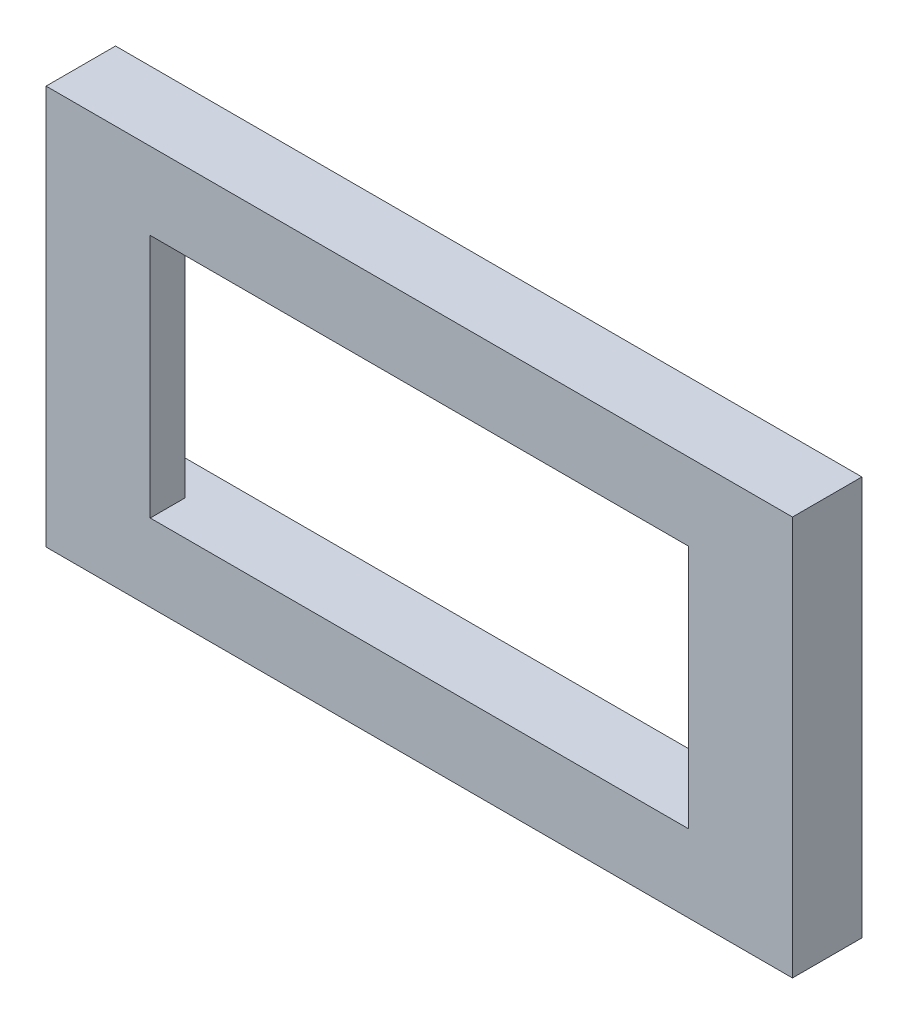
ISO-10303-21;
HEADER;
FILE_DESCRIPTION(('STEP AP214'),'2;1');
FILE_NAME('part.step','',(''),(''),'','','');
FILE_SCHEMA(('AUTOMOTIVE_DESIGN { 1 0 10303 214 1 1 1 1 }'));
ENDSEC;
DATA;
#1=APPLICATION_CONTEXT('core data for automotive mechanical design processes');
#2=APPLICATION_PROTOCOL_DEFINITION('international standard','automotive_design',2000,#1);
#3=PRODUCT_CONTEXT('',#1,'mechanical');
#4=PRODUCT('Part','Part','',(#3));
#5=PRODUCT_RELATED_PRODUCT_CATEGORY('part','',(#4));
#6=PRODUCT_DEFINITION_FORMATION('','',#4);
#7=PRODUCT_DEFINITION_CONTEXT('part definition',#1,'design');
#8=PRODUCT_DEFINITION('design','',#6,#7);
#9=PRODUCT_DEFINITION_SHAPE('','',#8);
#10=(LENGTH_UNIT() NAMED_UNIT(*) SI_UNIT(.MILLI.,.METRE.));
#11=(NAMED_UNIT(*) PLANE_ANGLE_UNIT() SI_UNIT($,.RADIAN.));
#12=(NAMED_UNIT(*) SI_UNIT($,.STERADIAN.) SOLID_ANGLE_UNIT());
#13=UNCERTAINTY_MEASURE_WITH_UNIT(LENGTH_MEASURE(1.E-05),#10,'distance_accuracy_value','');
#14=(GEOMETRIC_REPRESENTATION_CONTEXT(3) GLOBAL_UNCERTAINTY_ASSIGNED_CONTEXT((#13)) GLOBAL_UNIT_ASSIGNED_CONTEXT((#10,
#11,#12)) REPRESENTATION_CONTEXT('',''));
#15=CARTESIAN_POINT('',(0.,0.,0.));
#16=DIRECTION('',(0.,0.,1.));
#17=DIRECTION('',(1.,0.,0.));
#18=AXIS2_PLACEMENT_3D('',#15,#16,#17);
#19=CARTESIAN_POINT('',(0.,0.,0.));
#20=DIRECTION('',(0.,0.,-1.));
#21=DIRECTION('',(-1.,0.,0.));
#22=AXIS2_PLACEMENT_3D('',#19,#20,#21);
#23=PLANE('',#22);
#24=DIRECTION('',(0.,-1.,0.));
#25=VECTOR('',#24,1.);
#26=CARTESIAN_POINT('',(0.,0.,0.));
#27=LINE('',#26,#25);
#28=CARTESIAN_POINT('',(0.,23.,0.));
#29=VERTEX_POINT('',#28);
#30=CARTESIAN_POINT('',(0.,0.,0.));
#31=VERTEX_POINT('',#30);
#32=EDGE_CURVE('E208',#29,#31,#27,.T.);
#33=ORIENTED_EDGE('',*,*,#32,.F.);
#34=DIRECTION('',(-1.,0.,0.));
#35=VECTOR('',#34,1.);
#36=CARTESIAN_POINT('',(0.,23.,0.));
#37=LINE('',#36,#35);
#38=CARTESIAN_POINT('',(43.,23.,0.));
#39=VERTEX_POINT('',#38);
#40=EDGE_CURVE('E56',#39,#29,#37,.T.);
#41=ORIENTED_EDGE('',*,*,#40,.F.);
#42=DIRECTION('',(0.,1.,0.));
#43=VECTOR('',#42,1.);
#44=CARTESIAN_POINT('',(43.,0.,0.));
#45=LINE('',#44,#43);
#46=CARTESIAN_POINT('',(43.,0.,0.));
#47=VERTEX_POINT('',#46);
#48=EDGE_CURVE('E213',#47,#39,#45,.T.);
#49=ORIENTED_EDGE('',*,*,#48,.F.);
#50=DIRECTION('',(1.,0.,0.));
#51=VECTOR('',#50,1.);
#52=CARTESIAN_POINT('',(0.,0.,0.));
#53=LINE('',#52,#51);
#54=EDGE_CURVE('E211',#31,#47,#53,.T.);
#55=ORIENTED_EDGE('',*,*,#54,.F.);
#56=EDGE_LOOP('',(#33,#41,#49,#55));
#57=FACE_BOUND('',#56,.T.);
#58=DIRECTION('',(-1.,0.,0.));
#59=VECTOR('',#58,1.);
#60=CARTESIAN_POINT('',(3.99999999999999,18.55,0.));
#61=LINE('',#60,#59);
#62=CARTESIAN_POINT('',(39.,18.55,0.));
#63=VERTEX_POINT('',#62);
#64=CARTESIAN_POINT('',(3.99999999999999,18.55,0.));
#65=VERTEX_POINT('',#64);
#66=EDGE_CURVE('E182',#63,#65,#61,.T.);
#67=ORIENTED_EDGE('',*,*,#66,.T.);
#68=DIRECTION('',(0.,-1.,0.));
#69=VECTOR('',#68,1.);
#70=CARTESIAN_POINT('',(3.99999999999999,18.55,0.));
#71=LINE('',#70,#69);
#72=CARTESIAN_POINT('',(3.99999999999999,4.45,0.));
#73=VERTEX_POINT('',#72);
#74=EDGE_CURVE('E48',#65,#73,#71,.T.);
#75=ORIENTED_EDGE('',*,*,#74,.T.);
#76=DIRECTION('',(1.,0.,0.));
#77=VECTOR('',#76,1.);
#78=CARTESIAN_POINT('',(3.99999999999999,4.45,0.));
#79=LINE('',#78,#77);
#80=CARTESIAN_POINT('',(39.,4.45000000000001,0.));
#81=VERTEX_POINT('',#80);
#82=EDGE_CURVE('E193',#73,#81,#79,.T.);
#83=ORIENTED_EDGE('',*,*,#82,.T.);
#84=DIRECTION('',(0.,1.,0.));
#85=VECTOR('',#84,1.);
#86=CARTESIAN_POINT('',(39.,18.55,0.));
#87=LINE('',#86,#85);
#88=EDGE_CURVE('E196',#81,#63,#87,.T.);
#89=ORIENTED_EDGE('',*,*,#88,.T.);
#90=EDGE_LOOP('',(#67,#75,#83,#89));
#91=FACE_BOUND('',#90,.T.);
#92=ADVANCED_FACE('F33',(#57,#91),#23,.T.);
#93=CARTESIAN_POINT('',(0.,0.,2.));
#94=DIRECTION('',(1.,0.,0.));
#95=DIRECTION('',(0.,0.,-1.));
#96=AXIS2_PLACEMENT_3D('',#93,#94,#95);
#97=PLANE('',#96);
#98=ORIENTED_EDGE('',*,*,#32,.T.);
#99=DIRECTION('',(0.,0.,-1.));
#100=VECTOR('',#99,1.);
#101=CARTESIAN_POINT('',(0.,0.,2.));
#102=LINE('',#101,#100);
#103=CARTESIAN_POINT('',(0.,0.,4.));
#104=VERTEX_POINT('',#103);
#105=EDGE_CURVE('E11',#104,#31,#102,.T.);
#106=ORIENTED_EDGE('',*,*,#105,.F.);
#107=DIRECTION('',(0.,-1.,0.));
#108=VECTOR('',#107,1.);
#109=CARTESIAN_POINT('',(0.,23.,4.));
#110=LINE('',#109,#108);
#111=CARTESIAN_POINT('',(0.,23.,4.));
#112=VERTEX_POINT('',#111);
#113=EDGE_CURVE('E169',#112,#104,#110,.T.);
#114=ORIENTED_EDGE('',*,*,#113,.F.);
#115=DIRECTION('',(0.,0.,-1.));
#116=VECTOR('',#115,1.);
#117=CARTESIAN_POINT('',(0.,23.,2.));
#118=LINE('',#117,#116);
#119=EDGE_CURVE('E216',#112,#29,#118,.T.);
#120=ORIENTED_EDGE('',*,*,#119,.T.);
#121=EDGE_LOOP('',(#98,#106,#114,#120));
#122=FACE_BOUND('',#121,.T.);
#123=ADVANCED_FACE('F35',(#122),#97,.F.);
#124=CARTESIAN_POINT('',(0.,0.,2.));
#125=DIRECTION('',(0.,1.,0.));
#126=DIRECTION('',(-1.,0.,0.));
#127=AXIS2_PLACEMENT_3D('',#124,#125,#126);
#128=PLANE('',#127);
#129=ORIENTED_EDGE('',*,*,#54,.T.);
#130=DIRECTION('',(0.,0.,-1.));
#131=VECTOR('',#130,1.);
#132=CARTESIAN_POINT('',(43.,0.,2.));
#133=LINE('',#132,#131);
#134=CARTESIAN_POINT('',(43.,0.,4.));
#135=VERTEX_POINT('',#134);
#136=EDGE_CURVE('E41',#135,#47,#133,.T.);
#137=ORIENTED_EDGE('',*,*,#136,.F.);
#138=DIRECTION('',(1.,0.,0.));
#139=VECTOR('',#138,1.);
#140=CARTESIAN_POINT('',(0.,0.,4.));
#141=LINE('',#140,#139);
#142=EDGE_CURVE('E172',#104,#135,#141,.T.);
#143=ORIENTED_EDGE('',*,*,#142,.F.);
#144=ORIENTED_EDGE('',*,*,#105,.T.);
#145=EDGE_LOOP('',(#129,#137,#143,#144));
#146=FACE_BOUND('',#145,.T.);
#147=ADVANCED_FACE('F234',(#146),#128,.F.);
#148=CARTESIAN_POINT('',(43.,0.,2.));
#149=DIRECTION('',(-1.,0.,0.));
#150=DIRECTION('',(0.,0.,1.));
#151=AXIS2_PLACEMENT_3D('',#148,#149,#150);
#152=PLANE('',#151);
#153=ORIENTED_EDGE('',*,*,#48,.T.);
#154=DIRECTION('',(0.,0.,-1.));
#155=VECTOR('',#154,1.);
#156=CARTESIAN_POINT('',(43.,23.,2.));
#157=LINE('',#156,#155);
#158=CARTESIAN_POINT('',(43.,23.,4.));
#159=VERTEX_POINT('',#158);
#160=EDGE_CURVE('E218',#159,#39,#157,.T.);
#161=ORIENTED_EDGE('',*,*,#160,.F.);
#162=DIRECTION('',(0.,1.,0.));
#163=VECTOR('',#162,1.);
#164=CARTESIAN_POINT('',(43.,0.,4.));
#165=LINE('',#164,#163);
#166=EDGE_CURVE('E175',#135,#159,#165,.T.);
#167=ORIENTED_EDGE('',*,*,#166,.F.);
#168=ORIENTED_EDGE('',*,*,#136,.T.);
#169=EDGE_LOOP('',(#153,#161,#167,#168));
#170=FACE_BOUND('',#169,.T.);
#171=ADVANCED_FACE('F223',(#170),#152,.F.);
#172=CARTESIAN_POINT('',(0.,23.,2.));
#173=DIRECTION('',(0.,-1.,0.));
#174=DIRECTION('',(1.,0.,0.));
#175=AXIS2_PLACEMENT_3D('',#172,#173,#174);
#176=PLANE('',#175);
#177=ORIENTED_EDGE('',*,*,#40,.T.);
#178=ORIENTED_EDGE('',*,*,#119,.F.);
#179=DIRECTION('',(-1.,0.,0.));
#180=VECTOR('',#179,1.);
#181=CARTESIAN_POINT('',(43.,23.,4.));
#182=LINE('',#181,#180);
#183=EDGE_CURVE('E147',#159,#112,#182,.T.);
#184=ORIENTED_EDGE('',*,*,#183,.F.);
#185=ORIENTED_EDGE('',*,*,#160,.T.);
#186=EDGE_LOOP('',(#177,#178,#184,#185));
#187=FACE_BOUND('',#186,.T.);
#188=ADVANCED_FACE('F232',(#187),#176,.F.);
#189=CARTESIAN_POINT('',(3.99999999999999,18.55,2.));
#190=DIRECTION('',(1.,0.,0.));
#191=DIRECTION('',(0.,0.,-1.));
#192=AXIS2_PLACEMENT_3D('',#189,#190,#191);
#193=PLANE('',#192);
#194=ORIENTED_EDGE('',*,*,#74,.F.);
#195=DIRECTION('',(0.,0.,-1.));
#196=VECTOR('',#195,1.);
#197=CARTESIAN_POINT('',(3.99999999999999,18.55,2.));
#198=LINE('',#197,#196);
#199=CARTESIAN_POINT('',(3.99999999999999,18.55,2.));
#200=VERTEX_POINT('',#199);
#201=EDGE_CURVE('E191',#200,#65,#198,.T.);
#202=ORIENTED_EDGE('',*,*,#201,.F.);
#203=DIRECTION('',(0.,-1.,0.));
#204=VECTOR('',#203,1.);
#205=CARTESIAN_POINT('',(3.99999999999999,18.55,2.));
#206=LINE('',#205,#204);
#207=CARTESIAN_POINT('',(3.99999999999999,4.45,2.));
#208=VERTEX_POINT('',#207);
#209=EDGE_CURVE('E178',#200,#208,#206,.T.);
#210=ORIENTED_EDGE('',*,*,#209,.T.);
#211=DIRECTION('',(0.,0.,-1.));
#212=VECTOR('',#211,1.);
#213=CARTESIAN_POINT('',(3.99999999999999,4.45,2.));
#214=LINE('',#213,#212);
#215=EDGE_CURVE('E206',#208,#73,#214,.T.);
#216=ORIENTED_EDGE('',*,*,#215,.T.);
#217=EDGE_LOOP('',(#194,#202,#210,#216));
#218=FACE_BOUND('',#217,.T.);
#219=ADVANCED_FACE('F247',(#218),#193,.T.);
#220=CARTESIAN_POINT('',(3.99999999999999,4.45,2.));
#221=DIRECTION('',(0.,1.,0.));
#222=DIRECTION('',(-1.,0.,0.));
#223=AXIS2_PLACEMENT_3D('',#220,#221,#222);
#224=PLANE('',#223);
#225=ORIENTED_EDGE('',*,*,#82,.F.);
#226=ORIENTED_EDGE('',*,*,#215,.F.);
#227=DIRECTION('',(1.,0.,0.));
#228=VECTOR('',#227,1.);
#229=CARTESIAN_POINT('',(3.99999999999999,4.45,2.));
#230=LINE('',#229,#228);
#231=CARTESIAN_POINT('',(5.99999999999999,4.45,2.));
#232=VERTEX_POINT('',#231);
#233=EDGE_CURVE('E183',#208,#232,#230,.T.);
#234=ORIENTED_EDGE('',*,*,#233,.T.);
#235=DIRECTION('',(0.,0.,-1.));
#236=VECTOR('',#235,1.);
#237=CARTESIAN_POINT('',(5.99999999999999,4.45,4.));
#238=LINE('',#237,#236);
#239=CARTESIAN_POINT('',(5.99999999999999,4.45,4.));
#240=VERTEX_POINT('',#239);
#241=EDGE_CURVE('E164',#240,#232,#238,.T.);
#242=ORIENTED_EDGE('',*,*,#241,.F.);
#243=DIRECTION('',(1.,0.,0.));
#244=VECTOR('',#243,1.);
#245=CARTESIAN_POINT('',(5.99999999999999,4.45,4.));
#246=LINE('',#245,#244);
#247=CARTESIAN_POINT('',(37.,4.45000000000001,4.));
#248=VERTEX_POINT('',#247);
#249=EDGE_CURVE('E155',#240,#248,#246,.T.);
#250=ORIENTED_EDGE('',*,*,#249,.T.);
#251=DIRECTION('',(0.,0.,-1.));
#252=VECTOR('',#251,1.);
#253=CARTESIAN_POINT('',(37.,4.45000000000001,4.));
#254=LINE('',#253,#252);
#255=CARTESIAN_POINT('',(37.,4.45000000000001,2.));
#256=VERTEX_POINT('',#255);
#257=EDGE_CURVE('E132',#248,#256,#254,.T.);
#258=ORIENTED_EDGE('',*,*,#257,.T.);
#259=CARTESIAN_POINT('',(39.,4.45000000000001,2.));
#260=VERTEX_POINT('',#259);
#261=EDGE_CURVE('E181',#256,#260,#230,.T.);
#262=ORIENTED_EDGE('',*,*,#261,.T.);
#263=DIRECTION('',(0.,0.,-1.));
#264=VECTOR('',#263,1.);
#265=CARTESIAN_POINT('',(39.,4.45000000000001,2.));
#266=LINE('',#265,#264);
#267=EDGE_CURVE('E204',#260,#81,#266,.T.);
#268=ORIENTED_EDGE('',*,*,#267,.T.);
#269=EDGE_LOOP('',(#225,#226,#234,#242,#250,#258,#262,#268));
#270=FACE_BOUND('',#269,.T.);
#271=ADVANCED_FACE('F253',(#270),#224,.T.);
#272=CARTESIAN_POINT('',(39.,18.55,2.));
#273=DIRECTION('',(-1.,0.,0.));
#274=DIRECTION('',(0.,0.,1.));
#275=AXIS2_PLACEMENT_3D('',#272,#273,#274);
#276=PLANE('',#275);
#277=ORIENTED_EDGE('',*,*,#88,.F.);
#278=ORIENTED_EDGE('',*,*,#267,.F.);
#279=DIRECTION('',(0.,1.,0.));
#280=VECTOR('',#279,1.);
#281=CARTESIAN_POINT('',(39.,18.55,2.));
#282=LINE('',#281,#280);
#283=CARTESIAN_POINT('',(39.,18.55,2.));
#284=VERTEX_POINT('',#283);
#285=EDGE_CURVE('E186',#260,#284,#282,.T.);
#286=ORIENTED_EDGE('',*,*,#285,.T.);
#287=DIRECTION('',(0.,0.,-1.));
#288=VECTOR('',#287,1.);
#289=CARTESIAN_POINT('',(39.,18.55,2.));
#290=LINE('',#289,#288);
#291=EDGE_CURVE('E202',#284,#63,#290,.T.);
#292=ORIENTED_EDGE('',*,*,#291,.T.);
#293=EDGE_LOOP('',(#277,#278,#286,#292));
#294=FACE_BOUND('',#293,.T.);
#295=ADVANCED_FACE('F257',(#294),#276,.T.);
#296=CARTESIAN_POINT('',(3.99999999999999,18.55,2.));
#297=DIRECTION('',(0.,-1.,0.));
#298=DIRECTION('',(1.,0.,0.));
#299=AXIS2_PLACEMENT_3D('',#296,#297,#298);
#300=PLANE('',#299);
#301=ORIENTED_EDGE('',*,*,#66,.F.);
#302=ORIENTED_EDGE('',*,*,#291,.F.);
#303=DIRECTION('',(-1.,0.,0.));
#304=VECTOR('',#303,1.);
#305=CARTESIAN_POINT('',(3.99999999999999,18.55,2.));
#306=LINE('',#305,#304);
#307=CARTESIAN_POINT('',(37.,18.55,2.));
#308=VERTEX_POINT('',#307);
#309=EDGE_CURVE('E146',#284,#308,#306,.T.);
#310=ORIENTED_EDGE('',*,*,#309,.T.);
#311=DIRECTION('',(0.,0.,-1.));
#312=VECTOR('',#311,1.);
#313=CARTESIAN_POINT('',(37.,18.55,4.));
#314=LINE('',#313,#312);
#315=CARTESIAN_POINT('',(37.,18.55,4.));
#316=VERTEX_POINT('',#315);
#317=EDGE_CURVE('E129',#316,#308,#314,.T.);
#318=ORIENTED_EDGE('',*,*,#317,.F.);
#319=DIRECTION('',(-1.,0.,0.));
#320=VECTOR('',#319,1.);
#321=CARTESIAN_POINT('',(37.,18.55,4.));
#322=LINE('',#321,#320);
#323=CARTESIAN_POINT('',(5.99999999999999,18.55,4.));
#324=VERTEX_POINT('',#323);
#325=EDGE_CURVE('E136',#316,#324,#322,.T.);
#326=ORIENTED_EDGE('',*,*,#325,.T.);
#327=DIRECTION('',(0.,0.,-1.));
#328=VECTOR('',#327,1.);
#329=CARTESIAN_POINT('',(5.99999999999999,18.55,4.));
#330=LINE('',#329,#328);
#331=CARTESIAN_POINT('',(5.99999999999999,18.55,2.));
#332=VERTEX_POINT('',#331);
#333=EDGE_CURVE('E148',#324,#332,#330,.T.);
#334=ORIENTED_EDGE('',*,*,#333,.T.);
#335=EDGE_CURVE('E189',#332,#200,#306,.T.);
#336=ORIENTED_EDGE('',*,*,#335,.T.);
#337=ORIENTED_EDGE('',*,*,#201,.T.);
#338=EDGE_LOOP('',(#301,#302,#310,#318,#326,#334,#336,#337));
#339=FACE_BOUND('',#338,.T.);
#340=ADVANCED_FACE('F142',(#339),#300,.T.);
#341=CARTESIAN_POINT('',(0.,0.,2.));
#342=DIRECTION('',(0.,0.,1.));
#343=DIRECTION('',(1.,0.,0.));
#344=AXIS2_PLACEMENT_3D('',#341,#342,#343);
#345=PLANE('',#344);
#346=ORIENTED_EDGE('',*,*,#335,.F.);
#347=DIRECTION('',(0.,-1.,0.));
#348=VECTOR('',#347,1.);
#349=CARTESIAN_POINT('',(5.99999999999999,18.55,2.));
#350=LINE('',#349,#348);
#351=EDGE_CURVE('E137',#332,#232,#350,.T.);
#352=ORIENTED_EDGE('',*,*,#351,.T.);
#353=ORIENTED_EDGE('',*,*,#233,.F.);
#354=ORIENTED_EDGE('',*,*,#209,.F.);
#355=EDGE_LOOP('',(#346,#352,#353,#354));
#356=FACE_BOUND('',#355,.T.);
#357=ADVANCED_FACE('F267',(#356),#345,.F.);
#358=CARTESIAN_POINT('',(0.,0.,4.));
#359=DIRECTION('',(0.,0.,1.));
#360=DIRECTION('',(1.,0.,0.));
#361=AXIS2_PLACEMENT_3D('',#358,#359,#360);
#362=PLANE('',#361);
#363=ORIENTED_EDGE('',*,*,#183,.T.);
#364=ORIENTED_EDGE('',*,*,#113,.T.);
#365=ORIENTED_EDGE('',*,*,#142,.T.);
#366=ORIENTED_EDGE('',*,*,#166,.T.);
#367=EDGE_LOOP('',(#363,#364,#365,#366));
#368=FACE_BOUND('',#367,.T.);
#369=ORIENTED_EDGE('',*,*,#325,.F.);
#370=DIRECTION('',(0.,1.,0.));
#371=VECTOR('',#370,1.);
#372=CARTESIAN_POINT('',(37.,4.45000000000001,4.));
#373=LINE('',#372,#371);
#374=EDGE_CURVE('E125',#248,#316,#373,.T.);
#375=ORIENTED_EDGE('',*,*,#374,.F.);
#376=ORIENTED_EDGE('',*,*,#249,.F.);
#377=DIRECTION('',(0.,-1.,0.));
#378=VECTOR('',#377,1.);
#379=CARTESIAN_POINT('',(5.99999999999999,18.55,4.));
#380=LINE('',#379,#378);
#381=EDGE_CURVE('E153',#324,#240,#380,.T.);
#382=ORIENTED_EDGE('',*,*,#381,.F.);
#383=EDGE_LOOP('',(#369,#375,#376,#382));
#384=FACE_BOUND('',#383,.T.);
#385=ADVANCED_FACE('F151',(#368,#384),#362,.T.);
#386=ORIENTED_EDGE('',*,*,#309,.F.);
#387=ORIENTED_EDGE('',*,*,#285,.F.);
#388=ORIENTED_EDGE('',*,*,#261,.F.);
#389=DIRECTION('',(0.,1.,0.));
#390=VECTOR('',#389,1.);
#391=CARTESIAN_POINT('',(37.,4.45000000000001,2.));
#392=LINE('',#391,#390);
#393=EDGE_CURVE('E159',#256,#308,#392,.T.);
#394=ORIENTED_EDGE('',*,*,#393,.T.);
#395=EDGE_LOOP('',(#386,#387,#388,#394));
#396=FACE_BOUND('',#395,.T.);
#397=ADVANCED_FACE('F268',(#396),#345,.F.);
#398=CARTESIAN_POINT('',(37.,4.45000000000001,4.));
#399=DIRECTION('',(-1.,0.,0.));
#400=DIRECTION('',(0.,0.,1.));
#401=AXIS2_PLACEMENT_3D('',#398,#399,#400);
#402=PLANE('',#401);
#403=ORIENTED_EDGE('',*,*,#393,.F.);
#404=ORIENTED_EDGE('',*,*,#257,.F.);
#405=ORIENTED_EDGE('',*,*,#374,.T.);
#406=ORIENTED_EDGE('',*,*,#317,.T.);
#407=EDGE_LOOP('',(#403,#404,#405,#406));
#408=FACE_BOUND('',#407,.T.);
#409=ADVANCED_FACE('F128',(#408),#402,.T.);
#410=CARTESIAN_POINT('',(5.99999999999999,18.55,4.));
#411=DIRECTION('',(1.,0.,0.));
#412=DIRECTION('',(0.,0.,-1.));
#413=AXIS2_PLACEMENT_3D('',#410,#411,#412);
#414=PLANE('',#413);
#415=ORIENTED_EDGE('',*,*,#351,.F.);
#416=ORIENTED_EDGE('',*,*,#333,.F.);
#417=ORIENTED_EDGE('',*,*,#381,.T.);
#418=ORIENTED_EDGE('',*,*,#241,.T.);
#419=EDGE_LOOP('',(#415,#416,#417,#418));
#420=FACE_BOUND('',#419,.T.);
#421=ADVANCED_FACE('F276',(#420),#414,.T.);
#422=CLOSED_SHELL('',(#92,#123,#147,#171,#188,#219,#271,#295,#340,#357,#385,#397,#409,#421));
#423=MANIFOLD_SOLID_BREP('B2',#422);
#424=ADVANCED_BREP_SHAPE_REPRESENTATION('',(#18,#423),#14);
#425=SHAPE_DEFINITION_REPRESENTATION(#9,#424);
ENDSEC;
END-ISO-10303-21;
